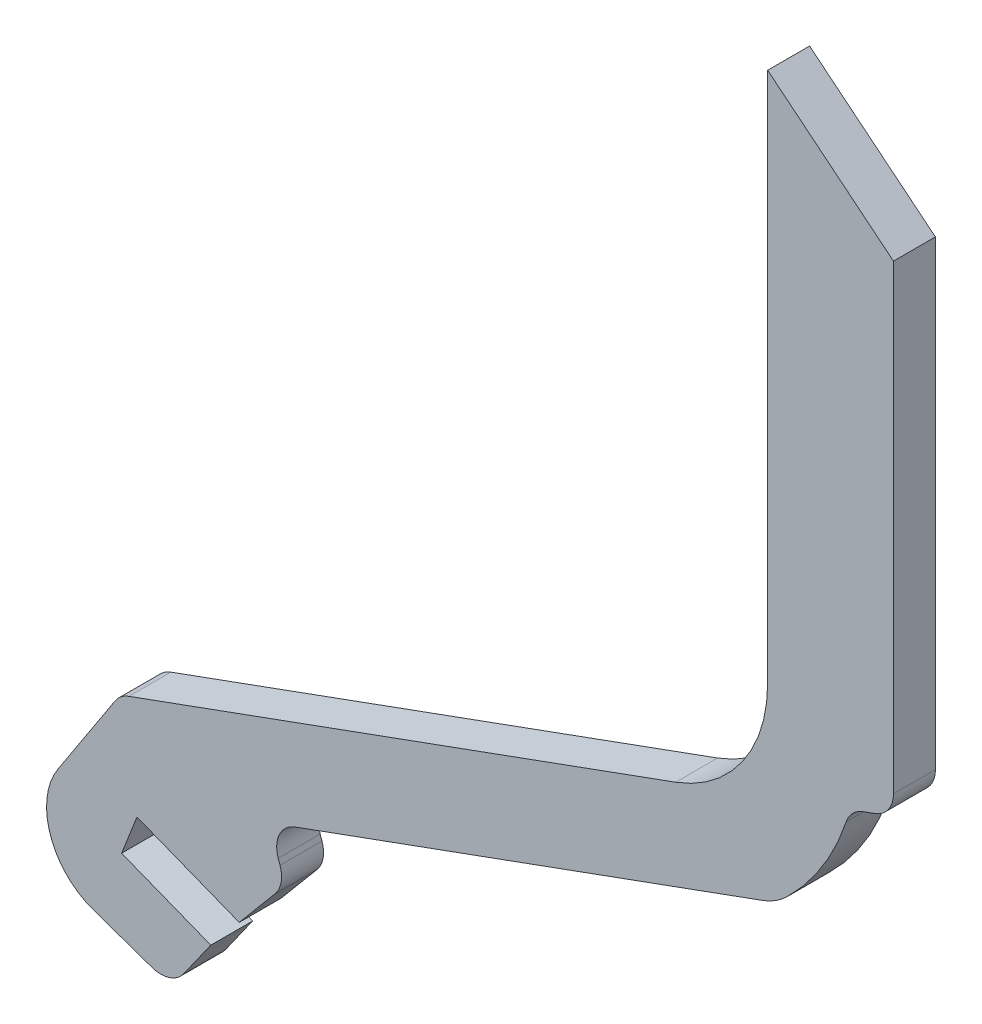
ISO-10303-21;
HEADER;
FILE_DESCRIPTION(('STEP AP214'),'2;1');
FILE_NAME('part.step','',(''),(''),'','','');
FILE_SCHEMA(('AUTOMOTIVE_DESIGN { 1 0 10303 214 1 1 1 1 }'));
ENDSEC;
DATA;
#1=APPLICATION_CONTEXT('core data for automotive mechanical design processes');
#2=APPLICATION_PROTOCOL_DEFINITION('international standard','automotive_design',2000,#1);
#3=PRODUCT_CONTEXT('',#1,'mechanical');
#4=PRODUCT('Part','Part','',(#3));
#5=PRODUCT_RELATED_PRODUCT_CATEGORY('part','',(#4));
#6=PRODUCT_DEFINITION_FORMATION('','',#4);
#7=PRODUCT_DEFINITION_CONTEXT('part definition',#1,'design');
#8=PRODUCT_DEFINITION('design','',#6,#7);
#9=PRODUCT_DEFINITION_SHAPE('','',#8);
#10=(LENGTH_UNIT() NAMED_UNIT(*) SI_UNIT(.MILLI.,.METRE.));
#11=(NAMED_UNIT(*) PLANE_ANGLE_UNIT() SI_UNIT($,.RADIAN.));
#12=(NAMED_UNIT(*) SI_UNIT($,.STERADIAN.) SOLID_ANGLE_UNIT());
#13=UNCERTAINTY_MEASURE_WITH_UNIT(LENGTH_MEASURE(1.E-05),#10,'distance_accuracy_value','');
#14=(GEOMETRIC_REPRESENTATION_CONTEXT(3) GLOBAL_UNCERTAINTY_ASSIGNED_CONTEXT((#13)) GLOBAL_UNIT_ASSIGNED_CONTEXT((#10,
#11,#12)) REPRESENTATION_CONTEXT('',''));
#15=CARTESIAN_POINT('',(0.,0.,0.));
#16=DIRECTION('',(0.,0.,1.));
#17=DIRECTION('',(1.,0.,0.));
#18=AXIS2_PLACEMENT_3D('',#15,#16,#17);
#19=CARTESIAN_POINT('',(731.665097740208,-38.5026520900211,3.0000000000001));
#20=DIRECTION('',(0.,0.,-1.));
#21=DIRECTION('',(-1.,0.,0.));
#22=AXIS2_PLACEMENT_3D('',#19,#20,#21);
#23=CYLINDRICAL_SURFACE('',#22,4.99999999999994);
#24=CARTESIAN_POINT('',(731.665097740208,-38.5026520900211,0.));
#25=DIRECTION('',(0.,0.,1.));
#26=DIRECTION('',(-1.,0.,0.));
#27=AXIS2_PLACEMENT_3D('',#24,#25,#26);
#28=CIRCLE('',#27,4.99999999999994);
#29=CARTESIAN_POINT('',(727.477141982781,-35.7711641120434,1.11022302462516E-13));
#30=VERTEX_POINT('',#29);
#31=CARTESIAN_POINT('',(730.013302652912,-43.2219288343526,0.));
#32=VERTEX_POINT('',#31);
#33=EDGE_CURVE('E196',#30,#32,#28,.T.);
#34=ORIENTED_EDGE('',*,*,#33,.T.);
#35=DIRECTION('',(0.,0.,-1.));
#36=VECTOR('',#35,1.);
#37=CARTESIAN_POINT('',(730.013302652912,-43.2219288343526,3.00000000000004));
#38=LINE('',#37,#36);
#39=CARTESIAN_POINT('',(730.013302652912,-43.2219288343526,3.00000000000004));
#40=VERTEX_POINT('',#39);
#41=EDGE_CURVE('E11',#40,#32,#38,.T.);
#42=ORIENTED_EDGE('',*,*,#41,.F.);
#43=CARTESIAN_POINT('',(731.665097740208,-38.5026520900211,3.0000000000001));
#44=DIRECTION('',(0.,0.,1.));
#45=DIRECTION('',(-1.,0.,0.));
#46=AXIS2_PLACEMENT_3D('',#43,#44,#45);
#47=CIRCLE('',#46,4.99999999999994);
#48=CARTESIAN_POINT('',(727.477141982781,-35.7711641120434,3.00000000000002));
#49=VERTEX_POINT('',#48);
#50=EDGE_CURVE('E255',#49,#40,#47,.T.);
#51=ORIENTED_EDGE('',*,*,#50,.F.);
#52=DIRECTION('',(0.,0.,-1.));
#53=VECTOR('',#52,1.);
#54=CARTESIAN_POINT('',(727.477141982781,-35.7711641120434,3.00000000000002));
#55=LINE('',#54,#53);
#56=EDGE_CURVE('E209',#49,#30,#55,.T.);
#57=ORIENTED_EDGE('',*,*,#56,.T.);
#58=EDGE_LOOP('',(#34,#42,#51,#57));
#59=FACE_BOUND('',#58,.T.);
#60=ADVANCED_FACE('F32',(#59),#23,.T.);
#61=CARTESIAN_POINT('',(734.180021910917,-44.6803231547908,3.00000000000009));
#62=DIRECTION('',(0.330359017459029,0.94385534886629,0.));
#63=DIRECTION('',(-0.943855348866289,0.33035901745903,0.));
#64=AXIS2_PLACEMENT_3D('',#61,#62,#63);
#65=PLANE('',#64);
#66=DIRECTION('',(0.943855348866289,-0.330359017459029,0.));
#67=VECTOR('',#66,1.);
#68=CARTESIAN_POINT('',(734.180021910917,-44.6803231547908,0.));
#69=LINE('',#68,#67);
#70=CARTESIAN_POINT('',(734.180021910917,-44.6803231547908,0.));
#71=VERTEX_POINT('',#70);
#72=EDGE_CURVE('E192',#32,#71,#69,.T.);
#73=ORIENTED_EDGE('',*,*,#72,.T.);
#74=DIRECTION('',(0.,0.,-1.));
#75=VECTOR('',#74,1.);
#76=CARTESIAN_POINT('',(734.180021910917,-44.6803231547908,3.00000000000009));
#77=LINE('',#76,#75);
#78=CARTESIAN_POINT('',(734.180021910917,-44.6803231547908,3.00000000000009));
#79=VERTEX_POINT('',#78);
#80=EDGE_CURVE('E39',#79,#71,#77,.T.);
#81=ORIENTED_EDGE('',*,*,#80,.F.);
#82=DIRECTION('',(0.943855348866289,-0.330359017459029,0.));
#83=VECTOR('',#82,1.);
#84=CARTESIAN_POINT('',(734.180021910917,-44.6803231547908,3.00000000000009));
#85=LINE('',#84,#83);
#86=EDGE_CURVE('E205',#40,#79,#85,.T.);
#87=ORIENTED_EDGE('',*,*,#86,.F.);
#88=ORIENTED_EDGE('',*,*,#41,.T.);
#89=EDGE_LOOP('',(#73,#81,#87,#88));
#90=FACE_BOUND('',#89,.T.);
#91=ADVANCED_FACE('F204',(#90),#65,.F.);
#92=CARTESIAN_POINT('',(734.840739945835,-42.7926124570583,3.0000000000001));
#93=DIRECTION('',(0.,0.,-1.));
#94=DIRECTION('',(-1.,0.,0.));
#95=AXIS2_PLACEMENT_3D('',#92,#93,#94);
#96=CYLINDRICAL_SURFACE('',#95,1.99999999999996);
#97=CARTESIAN_POINT('',(734.840739945835,-42.7926124570583,0.));
#98=DIRECTION('',(0.,0.,1.));
#99=DIRECTION('',(1.,0.,0.));
#100=AXIS2_PLACEMENT_3D('',#97,#98,#99);
#101=CIRCLE('',#100,1.99999999999996);
#102=CARTESIAN_POINT('',(736.473436896564,-43.9477317872912,0.));
#103=VERTEX_POINT('',#102);
#104=EDGE_CURVE('E198',#71,#103,#101,.T.);
#105=ORIENTED_EDGE('',*,*,#104,.T.);
#106=DIRECTION('',(0.,0.,-1.));
#107=VECTOR('',#106,1.);
#108=CARTESIAN_POINT('',(736.473436896564,-43.9477317872913,3.));
#109=LINE('',#108,#107);
#110=CARTESIAN_POINT('',(736.473436896564,-43.9477317872913,3.));
#111=VERTEX_POINT('',#110);
#112=EDGE_CURVE('E361',#111,#103,#109,.T.);
#113=ORIENTED_EDGE('',*,*,#112,.F.);
#114=CARTESIAN_POINT('',(734.840739945835,-42.7926124570583,3.0000000000001));
#115=DIRECTION('',(0.,0.,1.));
#116=DIRECTION('',(1.,0.,0.));
#117=AXIS2_PLACEMENT_3D('',#114,#115,#116);
#118=CIRCLE('',#117,1.99999999999996);
#119=EDGE_CURVE('E258',#79,#111,#118,.T.);
#120=ORIENTED_EDGE('',*,*,#119,.F.);
#121=ORIENTED_EDGE('',*,*,#80,.T.);
#122=EDGE_LOOP('',(#105,#113,#120,#121));
#123=FACE_BOUND('',#122,.T.);
#124=ADVANCED_FACE('F365',(#123),#96,.T.);
#125=CARTESIAN_POINT('',(738.412696802253,-41.2066957299584,3.00000000000006));
#126=DIRECTION('',(-0.816348475364847,0.577559665116506,0.));
#127=DIRECTION('',(-0.577559665116506,-0.816348475364847,0.));
#128=AXIS2_PLACEMENT_3D('',#125,#126,#127);
#129=PLANE('',#128);
#130=DIRECTION('',(0.577559665116506,0.816348475364847,0.));
#131=VECTOR('',#130,1.);
#132=CARTESIAN_POINT('',(738.412696802253,-41.2066957299584,0.));
#133=LINE('',#132,#131);
#134=CARTESIAN_POINT('',(738.412696802253,-41.2066957299584,0.));
#135=VERTEX_POINT('',#134);
#136=EDGE_CURVE('E213',#103,#135,#133,.T.);
#137=ORIENTED_EDGE('',*,*,#136,.T.);
#138=DIRECTION('',(0.,0.,-1.));
#139=VECTOR('',#138,1.);
#140=CARTESIAN_POINT('',(738.412696802253,-41.2066957299584,3.00000000000006));
#141=LINE('',#140,#139);
#142=CARTESIAN_POINT('',(738.412696802253,-41.2066957299584,3.00000000000006));
#143=VERTEX_POINT('',#142);
#144=EDGE_CURVE('E358',#143,#135,#141,.T.);
#145=ORIENTED_EDGE('',*,*,#144,.F.);
#146=DIRECTION('',(0.577559665116506,0.816348475364847,0.));
#147=VECTOR('',#146,1.);
#148=CARTESIAN_POINT('',(738.412696802253,-41.2066957299584,3.00000000000006));
#149=LINE('',#148,#147);
#150=EDGE_CURVE('E260',#111,#143,#149,.T.);
#151=ORIENTED_EDGE('',*,*,#150,.F.);
#152=ORIENTED_EDGE('',*,*,#112,.T.);
#153=EDGE_LOOP('',(#137,#145,#151,#152));
#154=FACE_BOUND('',#153,.T.);
#155=ADVANCED_FACE('F373',(#154),#129,.F.);
#156=CARTESIAN_POINT('',(732.034300263032,-38.7015367991553,3.));
#157=DIRECTION('',(-0.365571501050109,-0.930783260281345,0.));
#158=DIRECTION('',(0.930783260281345,-0.365571501050109,0.));
#159=AXIS2_PLACEMENT_3D('',#156,#157,#158);
#160=PLANE('',#159);
#161=DIRECTION('',(-0.930783260281345,0.365571501050109,0.));
#162=VECTOR('',#161,1.);
#163=CARTESIAN_POINT('',(732.034300263032,-38.7015367991552,0.));
#164=LINE('',#163,#162);
#165=CARTESIAN_POINT('',(732.034300263032,-38.7015367991552,0.));
#166=VERTEX_POINT('',#165);
#167=EDGE_CURVE('E215',#135,#166,#164,.T.);
#168=ORIENTED_EDGE('',*,*,#167,.T.);
#169=DIRECTION('',(0.,0.,-1.));
#170=VECTOR('',#169,1.);
#171=CARTESIAN_POINT('',(732.034300263032,-38.7015367991553,3.));
#172=LINE('',#171,#170);
#173=CARTESIAN_POINT('',(732.034300263032,-38.7015367991553,3.));
#174=VERTEX_POINT('',#173);
#175=EDGE_CURVE('E355',#174,#166,#172,.T.);
#176=ORIENTED_EDGE('',*,*,#175,.F.);
#177=DIRECTION('',(-0.930783260281345,0.365571501050109,0.));
#178=VECTOR('',#177,1.);
#179=CARTESIAN_POINT('',(732.034300263032,-38.7015367991553,3.));
#180=LINE('',#179,#178);
#181=EDGE_CURVE('E262',#143,#174,#180,.T.);
#182=ORIENTED_EDGE('',*,*,#181,.F.);
#183=ORIENTED_EDGE('',*,*,#144,.T.);
#184=EDGE_LOOP('',(#168,#176,#182,#183));
#185=FACE_BOUND('',#184,.T.);
#186=ADVANCED_FACE('F376',(#185),#160,.F.);
#187=CARTESIAN_POINT('',(733.131014766182,-35.9091870183113,2.99999999999999));
#188=DIRECTION('',(-0.930783260281333,0.365571501050141,0.));
#189=DIRECTION('',(-0.36557150105014,-0.930783260281333,0.));
#190=AXIS2_PLACEMENT_3D('',#187,#188,#189);
#191=PLANE('',#190);
#192=DIRECTION('',(0.36557150105014,0.930783260281333,0.));
#193=VECTOR('',#192,1.);
#194=CARTESIAN_POINT('',(733.131014766182,-35.9091870183113,0.));
#195=LINE('',#194,#193);
#196=CARTESIAN_POINT('',(733.131014766182,-35.9091870183113,0.));
#197=VERTEX_POINT('',#196);
#198=EDGE_CURVE('E217',#166,#197,#195,.T.);
#199=ORIENTED_EDGE('',*,*,#198,.T.);
#200=DIRECTION('',(0.,0.,-1.));
#201=VECTOR('',#200,1.);
#202=CARTESIAN_POINT('',(733.131014766182,-35.9091870183113,2.99999999999999));
#203=LINE('',#202,#201);
#204=CARTESIAN_POINT('',(733.131014766182,-35.9091870183113,2.99999999999999));
#205=VERTEX_POINT('',#204);
#206=EDGE_CURVE('E352',#205,#197,#203,.T.);
#207=ORIENTED_EDGE('',*,*,#206,.F.);
#208=DIRECTION('',(0.36557150105014,0.930783260281333,0.));
#209=VECTOR('',#208,1.);
#210=CARTESIAN_POINT('',(733.131014766182,-35.9091870183113,2.99999999999999));
#211=LINE('',#210,#209);
#212=EDGE_CURVE('E264',#174,#205,#211,.T.);
#213=ORIENTED_EDGE('',*,*,#212,.F.);
#214=ORIENTED_EDGE('',*,*,#175,.T.);
#215=EDGE_LOOP('',(#199,#207,#213,#214));
#216=FACE_BOUND('',#215,.T.);
#217=ADVANCED_FACE('F381',(#216),#191,.F.);
#218=CARTESIAN_POINT('',(740.44520688326,-38.781886072225,2.99999999999998));
#219=DIRECTION('',(0.365571501050109,0.930783260281345,0.));
#220=DIRECTION('',(-0.930783260281345,0.36557150105011,0.));
#221=AXIS2_PLACEMENT_3D('',#218,#219,#220);
#222=PLANE('',#221);
#223=DIRECTION('',(0.930783260281345,-0.365571501050109,0.));
#224=VECTOR('',#223,1.);
#225=CARTESIAN_POINT('',(740.44520688326,-38.781886072225,0.));
#226=LINE('',#225,#224);
#227=CARTESIAN_POINT('',(740.44520688326,-38.781886072225,0.));
#228=VERTEX_POINT('',#227);
#229=EDGE_CURVE('E219',#197,#228,#226,.T.);
#230=ORIENTED_EDGE('',*,*,#229,.T.);
#231=DIRECTION('',(0.,0.,-1.));
#232=VECTOR('',#231,1.);
#233=CARTESIAN_POINT('',(740.44520688326,-38.781886072225,2.99999999999998));
#234=LINE('',#233,#232);
#235=CARTESIAN_POINT('',(740.44520688326,-38.781886072225,2.99999999999998));
#236=VERTEX_POINT('',#235);
#237=EDGE_CURVE('E349',#236,#228,#234,.T.);
#238=ORIENTED_EDGE('',*,*,#237,.F.);
#239=DIRECTION('',(0.930783260281345,-0.365571501050109,0.));
#240=VECTOR('',#239,1.);
#241=CARTESIAN_POINT('',(740.44520688326,-38.781886072225,2.99999999999998));
#242=LINE('',#241,#240);
#243=EDGE_CURVE('E266',#205,#236,#242,.T.);
#244=ORIENTED_EDGE('',*,*,#243,.F.);
#245=ORIENTED_EDGE('',*,*,#206,.T.);
#246=EDGE_LOOP('',(#230,#238,#244,#245));
#247=FACE_BOUND('',#246,.T.);
#248=ADVANCED_FACE('F387',(#247),#222,.F.);
#249=CARTESIAN_POINT('',(743.008797080786,-35.7267182443839,2.99999999999996));
#250=DIRECTION('',(-0.766044443118979,0.642787609686538,0.));
#251=DIRECTION('',(-0.642787609686538,-0.766044443118979,0.));
#252=AXIS2_PLACEMENT_3D('',#249,#250,#251);
#253=PLANE('',#252);
#254=DIRECTION('',(0.642787609686538,0.766044443118979,0.));
#255=VECTOR('',#254,1.);
#256=CARTESIAN_POINT('',(743.008797080786,-35.7267182443839,0.));
#257=LINE('',#256,#255);
#258=CARTESIAN_POINT('',(743.008797080786,-35.7267182443839,0.));
#259=VERTEX_POINT('',#258);
#260=EDGE_CURVE('E221',#228,#259,#257,.T.);
#261=ORIENTED_EDGE('',*,*,#260,.T.);
#262=DIRECTION('',(0.,0.,-1.));
#263=VECTOR('',#262,1.);
#264=CARTESIAN_POINT('',(743.008797080786,-35.7267182443839,2.99999999999996));
#265=LINE('',#264,#263);
#266=CARTESIAN_POINT('',(743.008797080786,-35.7267182443839,2.99999999999996));
#267=VERTEX_POINT('',#266);
#268=EDGE_CURVE('E346',#267,#259,#265,.T.);
#269=ORIENTED_EDGE('',*,*,#268,.F.);
#270=DIRECTION('',(0.642787609686538,0.766044443118979,0.));
#271=VECTOR('',#270,1.);
#272=CARTESIAN_POINT('',(743.008797080786,-35.7267182443839,2.99999999999996));
#273=LINE('',#272,#271);
#274=EDGE_CURVE('E268',#236,#267,#273,.T.);
#275=ORIENTED_EDGE('',*,*,#274,.F.);
#276=ORIENTED_EDGE('',*,*,#237,.T.);
#277=EDGE_LOOP('',(#261,#269,#275,#276));
#278=FACE_BOUND('',#277,.T.);
#279=ADVANCED_FACE('F391',(#278),#253,.F.);
#280=CARTESIAN_POINT('',(741.476708194548,-34.4411430250107,2.99999999999993));
#281=DIRECTION('',(0.,0.,-1.));
#282=DIRECTION('',(-1.,0.,0.));
#283=AXIS2_PLACEMENT_3D('',#280,#281,#282);
#284=CYLINDRICAL_SURFACE('',#283,2.00000000000034);
#285=CARTESIAN_POINT('',(741.476708194548,-34.4411430250106,0.));
#286=DIRECTION('',(0.,0.,1.));
#287=DIRECTION('',(1.,0.,0.));
#288=AXIS2_PLACEMENT_3D('',#285,#286,#287);
#289=CIRCLE('',#288,2.00000000000034);
#290=CARTESIAN_POINT('',(743.365082604302,-33.7823243180887,0.));
#291=VERTEX_POINT('',#290);
#292=EDGE_CURVE('E223',#259,#291,#289,.T.);
#293=ORIENTED_EDGE('',*,*,#292,.T.);
#294=DIRECTION('',(0.,0.,-1.));
#295=VECTOR('',#294,1.);
#296=CARTESIAN_POINT('',(743.365082604301,-33.7823243180888,3.00000000000002));
#297=LINE('',#296,#295);
#298=CARTESIAN_POINT('',(743.365082604301,-33.7823243180888,3.00000000000002));
#299=VERTEX_POINT('',#298);
#300=EDGE_CURVE('E343',#299,#291,#297,.T.);
#301=ORIENTED_EDGE('',*,*,#300,.F.);
#302=CARTESIAN_POINT('',(741.476708194548,-34.4411430250107,2.99999999999993));
#303=DIRECTION('',(0.,0.,1.));
#304=DIRECTION('',(1.,0.,0.));
#305=AXIS2_PLACEMENT_3D('',#302,#303,#304);
#306=CIRCLE('',#305,2.00000000000034);
#307=EDGE_CURVE('E270',#267,#299,#306,.T.);
#308=ORIENTED_EDGE('',*,*,#307,.F.);
#309=ORIENTED_EDGE('',*,*,#268,.T.);
#310=EDGE_LOOP('',(#293,#301,#308,#309));
#311=FACE_BOUND('',#310,.T.);
#312=ADVANCED_FACE('F396',(#311),#284,.T.);
#313=CARTESIAN_POINT('',(743.236121599187,-33.4126829291073,3.00000000000009));
#314=DIRECTION('',(-0.944187204876439,-0.329409353461035,0.));
#315=DIRECTION('',(0.329409353461036,-0.944187204876439,0.));
#316=AXIS2_PLACEMENT_3D('',#313,#314,#315);
#317=PLANE('',#316);
#318=DIRECTION('',(-0.329409353461035,0.944187204876439,0.));
#319=VECTOR('',#318,1.);
#320=CARTESIAN_POINT('',(743.236121599187,-33.4126829291073,0.));
#321=LINE('',#320,#319);
#322=CARTESIAN_POINT('',(743.236121599187,-33.4126829291073,0.));
#323=VERTEX_POINT('',#322);
#324=EDGE_CURVE('E225',#291,#323,#321,.T.);
#325=ORIENTED_EDGE('',*,*,#324,.T.);
#326=DIRECTION('',(0.,0.,-1.));
#327=VECTOR('',#326,1.);
#328=CARTESIAN_POINT('',(743.236121599187,-33.4126829291073,3.00000000000009));
#329=LINE('',#328,#327);
#330=CARTESIAN_POINT('',(743.236121599187,-33.4126829291073,3.00000000000009));
#331=VERTEX_POINT('',#330);
#332=EDGE_CURVE('E340',#331,#323,#329,.T.);
#333=ORIENTED_EDGE('',*,*,#332,.F.);
#334=DIRECTION('',(-0.329409353461035,0.944187204876439,0.));
#335=VECTOR('',#334,1.);
#336=CARTESIAN_POINT('',(743.236121599187,-33.4126829291073,3.00000000000009));
#337=LINE('',#336,#335);
#338=EDGE_CURVE('E272',#299,#331,#337,.T.);
#339=ORIENTED_EDGE('',*,*,#338,.F.);
#340=ORIENTED_EDGE('',*,*,#300,.T.);
#341=EDGE_LOOP('',(#325,#333,#339,#340));
#342=FACE_BOUND('',#341,.T.);
#343=ADVANCED_FACE('F402',(#342),#317,.F.);
#344=CARTESIAN_POINT('',(745.12449600894,-32.7538642221856,3.00000000000009));
#345=DIRECTION('',(0.,0.,-1.));
#346=DIRECTION('',(-1.,0.,0.));
#347=AXIS2_PLACEMENT_3D('',#344,#345,#346);
#348=CYLINDRICAL_SURFACE('',#347,1.99999999999995);
#349=CARTESIAN_POINT('',(745.12449600894,-32.7538642221856,0.));
#350=DIRECTION('',(0.,0.,-1.));
#351=DIRECTION('',(-1.,0.,0.));
#352=AXIS2_PLACEMENT_3D('',#349,#350,#351);
#353=CIRCLE('',#352,1.99999999999995);
#354=CARTESIAN_POINT('',(744.440455722288,-30.8744789806137,0.));
#355=VERTEX_POINT('',#354);
#356=EDGE_CURVE('E227',#323,#355,#353,.T.);
#357=ORIENTED_EDGE('',*,*,#356,.T.);
#358=DIRECTION('',(0.,0.,-1.));
#359=VECTOR('',#358,1.);
#360=CARTESIAN_POINT('',(744.440455722288,-30.8744789806137,3.00000000000001));
#361=LINE('',#360,#359);
#362=CARTESIAN_POINT('',(744.440455722288,-30.8744789806137,3.00000000000001));
#363=VERTEX_POINT('',#362);
#364=EDGE_CURVE('E337',#363,#355,#361,.T.);
#365=ORIENTED_EDGE('',*,*,#364,.F.);
#366=CARTESIAN_POINT('',(745.12449600894,-32.7538642221856,3.00000000000009));
#367=DIRECTION('',(0.,0.,-1.));
#368=DIRECTION('',(-1.,0.,0.));
#369=AXIS2_PLACEMENT_3D('',#366,#367,#368);
#370=CIRCLE('',#369,1.99999999999995);
#371=EDGE_CURVE('E274',#331,#363,#370,.T.);
#372=ORIENTED_EDGE('',*,*,#371,.F.);
#373=ORIENTED_EDGE('',*,*,#332,.T.);
#374=EDGE_LOOP('',(#357,#365,#372,#373));
#375=FACE_BOUND('',#374,.T.);
#376=ADVANCED_FACE('F406',(#375),#348,.F.);
#377=CARTESIAN_POINT('',(777.875517605723,-18.7051116741952,3.00000000000003));
#378=DIRECTION('',(-0.342020143325666,0.93969262078591,0.));
#379=DIRECTION('',(-0.939692620785909,-0.342020143325666,0.));
#380=AXIS2_PLACEMENT_3D('',#377,#378,#379);
#381=PLANE('',#380);
#382=DIRECTION('',(0.939692620785909,0.342020143325666,0.));
#383=VECTOR('',#382,1.);
#384=CARTESIAN_POINT('',(777.875517605723,-18.7051116741952,0.));
#385=LINE('',#384,#383);
#386=CARTESIAN_POINT('',(777.875517605723,-18.7051116741952,0.));
#387=VERTEX_POINT('',#386);
#388=EDGE_CURVE('E229',#355,#387,#385,.T.);
#389=ORIENTED_EDGE('',*,*,#388,.T.);
#390=DIRECTION('',(0.,0.,-1.));
#391=VECTOR('',#390,1.);
#392=CARTESIAN_POINT('',(777.875517605723,-18.7051116741952,3.00000000000003));
#393=LINE('',#392,#391);
#394=CARTESIAN_POINT('',(777.875517605723,-18.7051116741952,3.00000000000003));
#395=VERTEX_POINT('',#394);
#396=EDGE_CURVE('E334',#395,#387,#393,.T.);
#397=ORIENTED_EDGE('',*,*,#396,.F.);
#398=DIRECTION('',(0.939692620785909,0.342020143325666,0.));
#399=VECTOR('',#398,1.);
#400=CARTESIAN_POINT('',(777.875517605723,-18.7051116741952,3.00000000000003));
#401=LINE('',#400,#399);
#402=EDGE_CURVE('E276',#363,#395,#401,.T.);
#403=ORIENTED_EDGE('',*,*,#402,.F.);
#404=ORIENTED_EDGE('',*,*,#364,.T.);
#405=EDGE_LOOP('',(#389,#397,#403,#404));
#406=FACE_BOUND('',#405,.T.);
#407=ADVANCED_FACE('F411',(#406),#381,.F.);
#408=CARTESIAN_POINT('',(776.201019456517,-14.1044658203345,3.00000000000003));
#409=DIRECTION('',(0.,0.,-1.));
#410=DIRECTION('',(-1.,0.,0.));
#411=AXIS2_PLACEMENT_3D('',#408,#409,#410);
#412=CYLINDRICAL_SURFACE('',#411,4.89590505671202);
#413=CARTESIAN_POINT('',(776.201019456517,-14.1044658203345,0.));
#414=DIRECTION('',(0.,0.,1.));
#415=DIRECTION('',(1.,0.,0.));
#416=AXIS2_PLACEMENT_3D('',#413,#414,#415);
#417=CIRCLE('',#416,4.89590505671202);
#418=CARTESIAN_POINT('',(779.609772483946,-17.6187636338858,0.));
#419=VERTEX_POINT('',#418);
#420=EDGE_CURVE('E231',#387,#419,#417,.T.);
#421=ORIENTED_EDGE('',*,*,#420,.T.);
#422=DIRECTION('',(0.,0.,-1.));
#423=VECTOR('',#422,1.);
#424=CARTESIAN_POINT('',(779.609772483946,-17.6187636338859,2.99999999999999));
#425=LINE('',#424,#423);
#426=CARTESIAN_POINT('',(779.609772483946,-17.6187636338859,2.99999999999999));
#427=VERTEX_POINT('',#426);
#428=EDGE_CURVE('E331',#427,#419,#425,.T.);
#429=ORIENTED_EDGE('',*,*,#428,.F.);
#430=CARTESIAN_POINT('',(776.201019456517,-14.1044658203345,3.00000000000003));
#431=DIRECTION('',(0.,0.,1.));
#432=DIRECTION('',(1.,0.,0.));
#433=AXIS2_PLACEMENT_3D('',#430,#431,#432);
#434=CIRCLE('',#433,4.89590505671202);
#435=EDGE_CURVE('E278',#395,#427,#434,.T.);
#436=ORIENTED_EDGE('',*,*,#435,.F.);
#437=ORIENTED_EDGE('',*,*,#396,.T.);
#438=EDGE_LOOP('',(#421,#429,#436,#437));
#439=FACE_BOUND('',#438,.T.);
#440=ADVANCED_FACE('F417',(#439),#412,.T.);
#441=CARTESIAN_POINT('',(767.914619544208,-5.56149516223356,2.99999999999996));
#442=DIRECTION('',(0.,0.,-1.));
#443=DIRECTION('',(-1.,0.,0.));
#444=AXIS2_PLACEMENT_3D('',#441,#442,#443);
#445=CYLINDRICAL_SURFACE('',#444,16.797449963651);
#446=CARTESIAN_POINT('',(767.914619544208,-5.56149516223355,0.));
#447=DIRECTION('',(0.,0.,1.));
#448=DIRECTION('',(1.,0.,0.));
#449=AXIS2_PLACEMENT_3D('',#446,#447,#448);
#450=CIRCLE('',#449,16.797449963651);
#451=CARTESIAN_POINT('',(783.855426972623,-10.8572466491857,0.));
#452=VERTEX_POINT('',#451);
#453=EDGE_CURVE('E233',#419,#452,#450,.T.);
#454=ORIENTED_EDGE('',*,*,#453,.T.);
#455=DIRECTION('',(0.,0.,-1.));
#456=VECTOR('',#455,1.);
#457=CARTESIAN_POINT('',(783.855426972623,-10.8572466491857,3.00000000000008));
#458=LINE('',#457,#456);
#459=CARTESIAN_POINT('',(783.855426972623,-10.8572466491857,3.00000000000008));
#460=VERTEX_POINT('',#459);
#461=EDGE_CURVE('E328',#460,#452,#458,.T.);
#462=ORIENTED_EDGE('',*,*,#461,.F.);
#463=CARTESIAN_POINT('',(767.914619544208,-5.56149516223356,2.99999999999996));
#464=DIRECTION('',(0.,0.,1.));
#465=DIRECTION('',(1.,0.,0.));
#466=AXIS2_PLACEMENT_3D('',#463,#464,#465);
#467=CIRCLE('',#466,16.797449963651);
#468=EDGE_CURVE('E280',#427,#460,#467,.T.);
#469=ORIENTED_EDGE('',*,*,#468,.F.);
#470=ORIENTED_EDGE('',*,*,#428,.T.);
#471=EDGE_LOOP('',(#454,#462,#469,#470));
#472=FACE_BOUND('',#471,.T.);
#473=ADVANCED_FACE('F421',(#472),#445,.T.);
#474=CARTESIAN_POINT('',(785.75343023656,-11.4877889634552,3.00000000000004));
#475=DIRECTION('',(0.,0.,-1.));
#476=DIRECTION('',(-1.,0.,0.));
#477=AXIS2_PLACEMENT_3D('',#474,#475,#476);
#478=CYLINDRICAL_SURFACE('',#477,2.00000000000014);
#479=CARTESIAN_POINT('',(785.75343023656,-11.4877889634552,0.));
#480=DIRECTION('',(0.,0.,-1.));
#481=DIRECTION('',(-1.,0.,0.));
#482=AXIS2_PLACEMENT_3D('',#479,#480,#481);
#483=CIRCLE('',#482,2.00000000000014);
#484=CARTESIAN_POINT('',(785.069389949909,-9.60840372188325,1.2490009027033E-13));
#485=VERTEX_POINT('',#484);
#486=EDGE_CURVE('E235',#452,#485,#483,.T.);
#487=ORIENTED_EDGE('',*,*,#486,.T.);
#488=DIRECTION('',(0.,0.,-1.));
#489=VECTOR('',#488,1.);
#490=CARTESIAN_POINT('',(785.069389949909,-9.60840372188326,3.00000000000004));
#491=LINE('',#490,#489);
#492=CARTESIAN_POINT('',(785.069389949909,-9.60840372188326,3.00000000000004));
#493=VERTEX_POINT('',#492);
#494=EDGE_CURVE('E325',#493,#485,#491,.T.);
#495=ORIENTED_EDGE('',*,*,#494,.F.);
#496=CARTESIAN_POINT('',(785.75343023656,-11.4877889634552,3.00000000000004));
#497=DIRECTION('',(0.,0.,-1.));
#498=DIRECTION('',(-1.,0.,0.));
#499=AXIS2_PLACEMENT_3D('',#496,#497,#498);
#500=CIRCLE('',#499,2.00000000000014);
#501=EDGE_CURVE('E282',#460,#493,#500,.T.);
#502=ORIENTED_EDGE('',*,*,#501,.F.);
#503=ORIENTED_EDGE('',*,*,#461,.T.);
#504=EDGE_LOOP('',(#487,#495,#502,#503));
#505=FACE_BOUND('',#504,.T.);
#506=ADVANCED_FACE('F426',(#505),#478,.F.);
#507=CARTESIAN_POINT('',(785.069389949909,-9.60840372188326,3.00000000000004));
#508=DIRECTION('',(-0.342020143325643,0.939692620785918,0.));
#509=DIRECTION('',(-0.939692620785918,-0.342020143325643,0.));
#510=AXIS2_PLACEMENT_3D('',#507,#508,#509);
#511=PLANE('',#510);
#512=DIRECTION('',(0.939692620785917,0.342020143325643,0.));
#513=VECTOR('',#512,1.);
#514=CARTESIAN_POINT('',(785.069389949909,-9.60840372188328,1.11022302462516E-13));
#515=LINE('',#514,#513);
#516=CARTESIAN_POINT('',(785.929105482362,-9.2954928581339,1.04083408558608E-13));
#517=VERTEX_POINT('',#516);
#518=EDGE_CURVE('E237',#485,#517,#515,.T.);
#519=ORIENTED_EDGE('',*,*,#518,.T.);
#520=DIRECTION('',(0.,0.,-1.));
#521=VECTOR('',#520,1.);
#522=CARTESIAN_POINT('',(785.929105482362,-9.29549285813387,3.00000000000005));
#523=LINE('',#522,#521);
#524=CARTESIAN_POINT('',(785.929105482362,-9.29549285813387,3.00000000000005));
#525=VERTEX_POINT('',#524);
#526=EDGE_CURVE('E322',#525,#517,#523,.T.);
#527=ORIENTED_EDGE('',*,*,#526,.F.);
#528=DIRECTION('',(0.939692620785917,0.342020143325643,0.));
#529=VECTOR('',#528,1.);
#530=CARTESIAN_POINT('',(785.069389949909,-9.60840372188326,3.00000000000004));
#531=LINE('',#530,#529);
#532=EDGE_CURVE('E284',#493,#525,#531,.T.);
#533=ORIENTED_EDGE('',*,*,#532,.F.);
#534=ORIENTED_EDGE('',*,*,#494,.T.);
#535=EDGE_LOOP('',(#519,#527,#533,#534));
#536=FACE_BOUND('',#535,.T.);
#537=ADVANCED_FACE('F432',(#536),#511,.F.);
#538=CARTESIAN_POINT('',(785.245065195711,-7.41610761656218,3.00000000000009));
#539=DIRECTION('',(0.,0.,-1.));
#540=DIRECTION('',(-1.,0.,0.));
#541=AXIS2_PLACEMENT_3D('',#538,#539,#540);
#542=CYLINDRICAL_SURFACE('',#541,1.99999999999992);
#543=CARTESIAN_POINT('',(785.245065195711,-7.4161076165622,0.));
#544=DIRECTION('',(0.,0.,1.));
#545=DIRECTION('',(1.,0.,0.));
#546=AXIS2_PLACEMENT_3D('',#543,#544,#545);
#547=CIRCLE('',#546,1.99999999999992);
#548=CARTESIAN_POINT('',(787.24506519571,-7.41610761656213,0.));
#549=VERTEX_POINT('',#548);
#550=EDGE_CURVE('E239',#517,#549,#547,.T.);
#551=ORIENTED_EDGE('',*,*,#550,.T.);
#552=DIRECTION('',(0.,0.,-1.));
#553=VECTOR('',#552,1.);
#554=CARTESIAN_POINT('',(787.245065195711,-7.41610761656211,3.00000000000003));
#555=LINE('',#554,#553);
#556=CARTESIAN_POINT('',(787.245065195711,-7.41610761656211,3.00000000000003));
#557=VERTEX_POINT('',#556);
#558=EDGE_CURVE('E319',#557,#549,#555,.T.);
#559=ORIENTED_EDGE('',*,*,#558,.F.);
#560=CARTESIAN_POINT('',(785.245065195711,-7.41610761656218,3.00000000000009));
#561=DIRECTION('',(0.,0.,1.));
#562=DIRECTION('',(1.,0.,0.));
#563=AXIS2_PLACEMENT_3D('',#560,#561,#562);
#564=CIRCLE('',#563,1.99999999999992);
#565=EDGE_CURVE('E286',#525,#557,#564,.T.);
#566=ORIENTED_EDGE('',*,*,#565,.F.);
#567=ORIENTED_EDGE('',*,*,#526,.T.);
#568=EDGE_LOOP('',(#551,#559,#566,#567));
#569=FACE_BOUND('',#568,.T.);
#570=ADVANCED_FACE('F436',(#569),#542,.T.);
#571=CARTESIAN_POINT('',(787.24506519571,25.5838923834379,3.));
#572=DIRECTION('',(-1.,0.,0.));
#573=DIRECTION('',(0.,0.,1.));
#574=AXIS2_PLACEMENT_3D('',#571,#572,#573);
#575=PLANE('',#574);
#576=DIRECTION('',(0.,1.,0.));
#577=VECTOR('',#576,1.);
#578=CARTESIAN_POINT('',(787.24506519571,25.5838923834379,0.));
#579=LINE('',#578,#577);
#580=CARTESIAN_POINT('',(787.24506519571,25.5838923834379,0.));
#581=VERTEX_POINT('',#580);
#582=EDGE_CURVE('E241',#549,#581,#579,.T.);
#583=ORIENTED_EDGE('',*,*,#582,.T.);
#584=DIRECTION('',(0.,0.,-1.));
#585=VECTOR('',#584,1.);
#586=CARTESIAN_POINT('',(787.24506519571,25.5838923834379,3.));
#587=LINE('',#586,#585);
#588=CARTESIAN_POINT('',(787.24506519571,25.5838923834379,3.));
#589=VERTEX_POINT('',#588);
#590=EDGE_CURVE('E316',#589,#581,#587,.T.);
#591=ORIENTED_EDGE('',*,*,#590,.F.);
#592=DIRECTION('',(0.,1.,0.));
#593=VECTOR('',#592,1.);
#594=CARTESIAN_POINT('',(787.24506519571,25.5838923834379,3.));
#595=LINE('',#594,#593);
#596=EDGE_CURVE('E288',#557,#589,#595,.T.);
#597=ORIENTED_EDGE('',*,*,#596,.F.);
#598=ORIENTED_EDGE('',*,*,#558,.T.);
#599=EDGE_LOOP('',(#583,#591,#597,#598));
#600=FACE_BOUND('',#599,.T.);
#601=ADVANCED_FACE('F441',(#600),#575,.F.);
#602=CARTESIAN_POINT('',(778.245065195711,32.9098205807198,3.00000000000001));
#603=DIRECTION('',(-0.631289373675162,-0.775547372302183,0.));
#604=DIRECTION('',(0.775547372302183,-0.631289373675162,0.));
#605=AXIS2_PLACEMENT_3D('',#602,#603,#604);
#606=PLANE('',#605);
#607=DIRECTION('',(-0.775547372302183,0.631289373675162,0.));
#608=VECTOR('',#607,1.);
#609=CARTESIAN_POINT('',(778.245065195711,32.9098205807198,0.));
#610=LINE('',#609,#608);
#611=CARTESIAN_POINT('',(778.245065195711,32.9098205807198,0.));
#612=VERTEX_POINT('',#611);
#613=EDGE_CURVE('E243',#581,#612,#610,.T.);
#614=ORIENTED_EDGE('',*,*,#613,.T.);
#615=DIRECTION('',(0.,0.,-1.));
#616=VECTOR('',#615,1.);
#617=CARTESIAN_POINT('',(778.245065195711,32.9098205807198,3.00000000000001));
#618=LINE('',#617,#616);
#619=CARTESIAN_POINT('',(778.245065195711,32.9098205807198,3.00000000000001));
#620=VERTEX_POINT('',#619);
#621=EDGE_CURVE('E313',#620,#612,#618,.T.);
#622=ORIENTED_EDGE('',*,*,#621,.F.);
#623=DIRECTION('',(-0.775547372302183,0.631289373675162,0.));
#624=VECTOR('',#623,1.);
#625=CARTESIAN_POINT('',(778.245065195711,32.9098205807198,3.00000000000001));
#626=LINE('',#625,#624);
#627=EDGE_CURVE('E290',#589,#620,#626,.T.);
#628=ORIENTED_EDGE('',*,*,#627,.F.);
#629=ORIENTED_EDGE('',*,*,#590,.T.);
#630=EDGE_LOOP('',(#614,#622,#628,#629));
#631=FACE_BOUND('',#630,.T.);
#632=ADVANCED_FACE('F447',(#631),#606,.F.);
#633=CARTESIAN_POINT('',(778.245065195711,-5.09017941928032,2.99999999999998));
#634=DIRECTION('',(1.,0.,0.));
#635=DIRECTION('',(0.,0.,-1.));
#636=AXIS2_PLACEMENT_3D('',#633,#634,#635);
#637=PLANE('',#636);
#638=DIRECTION('',(0.,-1.,0.));
#639=VECTOR('',#638,1.);
#640=CARTESIAN_POINT('',(778.245065195711,-5.09017941928031,0.));
#641=LINE('',#640,#639);
#642=CARTESIAN_POINT('',(778.245065195711,-5.09017941928031,0.));
#643=VERTEX_POINT('',#642);
#644=EDGE_CURVE('E245',#612,#643,#641,.T.);
#645=ORIENTED_EDGE('',*,*,#644,.T.);
#646=DIRECTION('',(0.,0.,-1.));
#647=VECTOR('',#646,1.);
#648=CARTESIAN_POINT('',(778.245065195711,-5.09017941928032,2.99999999999998));
#649=LINE('',#648,#647);
#650=CARTESIAN_POINT('',(778.245065195711,-5.09017941928032,2.99999999999998));
#651=VERTEX_POINT('',#650);
#652=EDGE_CURVE('E310',#651,#643,#649,.T.);
#653=ORIENTED_EDGE('',*,*,#652,.F.);
#654=DIRECTION('',(0.,-1.,0.));
#655=VECTOR('',#654,1.);
#656=CARTESIAN_POINT('',(778.245065195711,-5.09017941928032,2.99999999999998));
#657=LINE('',#656,#655);
#658=EDGE_CURVE('E292',#620,#651,#657,.T.);
#659=ORIENTED_EDGE('',*,*,#658,.F.);
#660=ORIENTED_EDGE('',*,*,#621,.T.);
#661=EDGE_LOOP('',(#645,#653,#659,#660));
#662=FACE_BOUND('',#661,.T.);
#663=ADVANCED_FACE('F451',(#662),#637,.F.);
#664=CARTESIAN_POINT('',(768.245065195711,-5.09017941928031,3.00000000000002));
#665=DIRECTION('',(0.,0.,-1.));
#666=DIRECTION('',(-1.,0.,0.));
#667=AXIS2_PLACEMENT_3D('',#664,#665,#666);
#668=CYLINDRICAL_SURFACE('',#667,9.99999999999999);
#669=CARTESIAN_POINT('',(768.245065195711,-5.09017941928029,1.11022302462516E-13));
#670=DIRECTION('',(0.,0.,-1.));
#671=DIRECTION('',(1.,0.,0.));
#672=AXIS2_PLACEMENT_3D('',#669,#670,#671);
#673=CIRCLE('',#672,9.99999999999999);
#674=CARTESIAN_POINT('',(771.665266628968,-14.4871056271394,1.2490009027033E-13));
#675=VERTEX_POINT('',#674);
#676=EDGE_CURVE('E247',#643,#675,#673,.T.);
#677=ORIENTED_EDGE('',*,*,#676,.T.);
#678=DIRECTION('',(0.,0.,-1.));
#679=VECTOR('',#678,1.);
#680=CARTESIAN_POINT('',(771.665266628967,-14.4871056271394,3.00000000000003));
#681=LINE('',#680,#679);
#682=CARTESIAN_POINT('',(771.665266628967,-14.4871056271394,3.00000000000003));
#683=VERTEX_POINT('',#682);
#684=EDGE_CURVE('E307',#683,#675,#681,.T.);
#685=ORIENTED_EDGE('',*,*,#684,.F.);
#686=CARTESIAN_POINT('',(768.245065195711,-5.09017941928031,3.00000000000002));
#687=DIRECTION('',(0.,0.,-1.));
#688=DIRECTION('',(1.,0.,0.));
#689=AXIS2_PLACEMENT_3D('',#686,#687,#688);
#690=CIRCLE('',#689,9.99999999999999);
#691=EDGE_CURVE('E294',#651,#683,#690,.T.);
#692=ORIENTED_EDGE('',*,*,#691,.F.);
#693=ORIENTED_EDGE('',*,*,#652,.T.);
#694=EDGE_LOOP('',(#677,#685,#692,#693));
#695=FACE_BOUND('',#694,.T.);
#696=ADVANCED_FACE('F456',(#695),#668,.F.);
#697=CARTESIAN_POINT('',(732.551993884642,-28.7231726708093,3.00000000000004));
#698=DIRECTION('',(0.342020143325666,-0.93969262078591,0.));
#699=DIRECTION('',(0.939692620785909,0.342020143325666,0.));
#700=AXIS2_PLACEMENT_3D('',#697,#698,#699);
#701=PLANE('',#700);
#702=DIRECTION('',(-0.939692620785909,-0.342020143325666,0.));
#703=VECTOR('',#702,1.);
#704=CARTESIAN_POINT('',(732.551993884642,-28.7231726708094,0.));
#705=LINE('',#704,#703);
#706=CARTESIAN_POINT('',(732.551993884642,-28.7231726708094,0.));
#707=VERTEX_POINT('',#706);
#708=EDGE_CURVE('E249',#675,#707,#705,.T.);
#709=ORIENTED_EDGE('',*,*,#708,.T.);
#710=DIRECTION('',(0.,0.,-1.));
#711=VECTOR('',#710,1.);
#712=CARTESIAN_POINT('',(732.551993884642,-28.7231726708093,3.00000000000004));
#713=LINE('',#712,#711);
#714=CARTESIAN_POINT('',(732.551993884642,-28.7231726708093,3.00000000000004));
#715=VERTEX_POINT('',#714);
#716=EDGE_CURVE('E304',#715,#707,#713,.T.);
#717=ORIENTED_EDGE('',*,*,#716,.F.);
#718=DIRECTION('',(-0.939692620785909,-0.342020143325666,0.));
#719=VECTOR('',#718,1.);
#720=CARTESIAN_POINT('',(732.551993884642,-28.7231726708093,3.00000000000004));
#721=LINE('',#720,#719);
#722=EDGE_CURVE('E296',#683,#715,#721,.T.);
#723=ORIENTED_EDGE('',*,*,#722,.F.);
#724=ORIENTED_EDGE('',*,*,#684,.T.);
#725=EDGE_LOOP('',(#709,#717,#723,#724));
#726=FACE_BOUND('',#725,.T.);
#727=ADVANCED_FACE('F460',(#726),#701,.F.);
#728=CARTESIAN_POINT('',(733.236034171293,-30.6025579123812,3.00000000000002));
#729=DIRECTION('',(0.,0.,-1.));
#730=DIRECTION('',(-1.,0.,0.));
#731=AXIS2_PLACEMENT_3D('',#728,#729,#730);
#732=CYLINDRICAL_SURFACE('',#731,2.00000000000003);
#733=CARTESIAN_POINT('',(733.236034171293,-30.6025579123812,0.));
#734=DIRECTION('',(0.,0.,1.));
#735=DIRECTION('',(-1.,0.,0.));
#736=AXIS2_PLACEMENT_3D('',#733,#734,#735);
#737=CIRCLE('',#736,2.00000000000003);
#738=CARTESIAN_POINT('',(731.560851868322,-29.50996272119,0.));
#739=VERTEX_POINT('',#738);
#740=EDGE_CURVE('E251',#707,#739,#737,.T.);
#741=ORIENTED_EDGE('',*,*,#740,.T.);
#742=DIRECTION('',(0.,0.,-1.));
#743=VECTOR('',#742,1.);
#744=CARTESIAN_POINT('',(731.560851868322,-29.50996272119,3.00000000000007));
#745=LINE('',#744,#743);
#746=CARTESIAN_POINT('',(731.560851868322,-29.50996272119,3.00000000000007));
#747=VERTEX_POINT('',#746);
#748=EDGE_CURVE('E301',#747,#739,#745,.T.);
#749=ORIENTED_EDGE('',*,*,#748,.F.);
#750=CARTESIAN_POINT('',(733.236034171293,-30.6025579123812,3.00000000000002));
#751=DIRECTION('',(0.,0.,1.));
#752=DIRECTION('',(-1.,0.,0.));
#753=AXIS2_PLACEMENT_3D('',#750,#751,#752);
#754=CIRCLE('',#753,2.00000000000003);
#755=EDGE_CURVE('E51',#715,#747,#754,.T.);
#756=ORIENTED_EDGE('',*,*,#755,.F.);
#757=ORIENTED_EDGE('',*,*,#716,.T.);
#758=EDGE_LOOP('',(#741,#749,#756,#757));
#759=FACE_BOUND('',#758,.T.);
#760=ADVANCED_FACE('F464',(#759),#732,.T.);
#761=CARTESIAN_POINT('',(727.477141982781,-35.7711641120434,3.00000000000002));
#762=DIRECTION('',(0.83759115148534,-0.546297595595535,0.));
#763=DIRECTION('',(0.546297595595535,0.83759115148534,0.));
#764=AXIS2_PLACEMENT_3D('',#761,#762,#763);
#765=PLANE('',#764);
#766=DIRECTION('',(-0.546297595595534,-0.83759115148534,0.));
#767=VECTOR('',#766,1.);
#768=CARTESIAN_POINT('',(727.477141982781,-35.7711641120434,1.11022302462516E-13));
#769=LINE('',#768,#767);
#770=EDGE_CURVE('E253',#739,#30,#769,.T.);
#771=ORIENTED_EDGE('',*,*,#770,.T.);
#772=ORIENTED_EDGE('',*,*,#56,.F.);
#773=DIRECTION('',(-0.546297595595534,-0.83759115148534,0.));
#774=VECTOR('',#773,1.);
#775=CARTESIAN_POINT('',(727.477141982781,-35.7711641120434,3.00000000000002));
#776=LINE('',#775,#774);
#777=EDGE_CURVE('E46',#747,#49,#776,.T.);
#778=ORIENTED_EDGE('',*,*,#777,.F.);
#779=ORIENTED_EDGE('',*,*,#748,.T.);
#780=EDGE_LOOP('',(#771,#772,#778,#779));
#781=FACE_BOUND('',#780,.T.);
#782=ADVANCED_FACE('F466',(#781),#765,.F.);
#783=CARTESIAN_POINT('',(731.665097740208,-38.5026520900211,3.0000000000001));
#784=DIRECTION('',(0.,0.,-1.));
#785=DIRECTION('',(-1.,0.,0.));
#786=AXIS2_PLACEMENT_3D('',#783,#784,#785);
#787=PLANE('',#786);
#788=ORIENTED_EDGE('',*,*,#50,.T.);
#789=ORIENTED_EDGE('',*,*,#86,.T.);
#790=ORIENTED_EDGE('',*,*,#119,.T.);
#791=ORIENTED_EDGE('',*,*,#150,.T.);
#792=ORIENTED_EDGE('',*,*,#181,.T.);
#793=ORIENTED_EDGE('',*,*,#212,.T.);
#794=ORIENTED_EDGE('',*,*,#243,.T.);
#795=ORIENTED_EDGE('',*,*,#274,.T.);
#796=ORIENTED_EDGE('',*,*,#307,.T.);
#797=ORIENTED_EDGE('',*,*,#338,.T.);
#798=ORIENTED_EDGE('',*,*,#371,.T.);
#799=ORIENTED_EDGE('',*,*,#402,.T.);
#800=ORIENTED_EDGE('',*,*,#435,.T.);
#801=ORIENTED_EDGE('',*,*,#468,.T.);
#802=ORIENTED_EDGE('',*,*,#501,.T.);
#803=ORIENTED_EDGE('',*,*,#532,.T.);
#804=ORIENTED_EDGE('',*,*,#565,.T.);
#805=ORIENTED_EDGE('',*,*,#596,.T.);
#806=ORIENTED_EDGE('',*,*,#627,.T.);
#807=ORIENTED_EDGE('',*,*,#658,.T.);
#808=ORIENTED_EDGE('',*,*,#691,.T.);
#809=ORIENTED_EDGE('',*,*,#722,.T.);
#810=ORIENTED_EDGE('',*,*,#755,.T.);
#811=ORIENTED_EDGE('',*,*,#777,.T.);
#812=EDGE_LOOP('',(#788,#789,#790,#791,#792,#793,#794,#795,#796,#797,#798,#799,#800,#801,#802,
#803,#804,#805,#806,#807,#808,#809,#810,#811));
#813=FACE_BOUND('',#812,.T.);
#814=ADVANCED_FACE('F368',(#813),#787,.F.);
#815=CARTESIAN_POINT('',(731.665097740208,-38.5026520900211,0.));
#816=DIRECTION('',(0.,0.,-1.));
#817=DIRECTION('',(-1.,0.,0.));
#818=AXIS2_PLACEMENT_3D('',#815,#816,#817);
#819=PLANE('',#818);
#820=ORIENTED_EDGE('',*,*,#33,.F.);
#821=ORIENTED_EDGE('',*,*,#770,.F.);
#822=ORIENTED_EDGE('',*,*,#740,.F.);
#823=ORIENTED_EDGE('',*,*,#708,.F.);
#824=ORIENTED_EDGE('',*,*,#676,.F.);
#825=ORIENTED_EDGE('',*,*,#644,.F.);
#826=ORIENTED_EDGE('',*,*,#613,.F.);
#827=ORIENTED_EDGE('',*,*,#582,.F.);
#828=ORIENTED_EDGE('',*,*,#550,.F.);
#829=ORIENTED_EDGE('',*,*,#518,.F.);
#830=ORIENTED_EDGE('',*,*,#486,.F.);
#831=ORIENTED_EDGE('',*,*,#453,.F.);
#832=ORIENTED_EDGE('',*,*,#420,.F.);
#833=ORIENTED_EDGE('',*,*,#388,.F.);
#834=ORIENTED_EDGE('',*,*,#356,.F.);
#835=ORIENTED_EDGE('',*,*,#324,.F.);
#836=ORIENTED_EDGE('',*,*,#292,.F.);
#837=ORIENTED_EDGE('',*,*,#260,.F.);
#838=ORIENTED_EDGE('',*,*,#229,.F.);
#839=ORIENTED_EDGE('',*,*,#198,.F.);
#840=ORIENTED_EDGE('',*,*,#167,.F.);
#841=ORIENTED_EDGE('',*,*,#136,.F.);
#842=ORIENTED_EDGE('',*,*,#104,.F.);
#843=ORIENTED_EDGE('',*,*,#72,.F.);
#844=EDGE_LOOP('',(#820,#821,#822,#823,#824,#825,#826,#827,#828,#829,#830,#831,#832,#833,#834,
#835,#836,#837,#838,#839,#840,#841,#842,#843));
#845=FACE_BOUND('',#844,.T.);
#846=ADVANCED_FACE('F193',(#845),#819,.T.);
#847=CLOSED_SHELL('',(#60,#91,#124,#155,#186,#217,#248,#279,#312,#343,#376,#407,#440,#473,#506,
#537,#570,#601,#632,#663,#696,#727,#760,#782,#814,#846));
#848=MANIFOLD_SOLID_BREP('B2',#847);
#849=ADVANCED_BREP_SHAPE_REPRESENTATION('',(#18,#848),#14);
#850=SHAPE_DEFINITION_REPRESENTATION(#9,#849);
ENDSEC;
END-ISO-10303-21;
